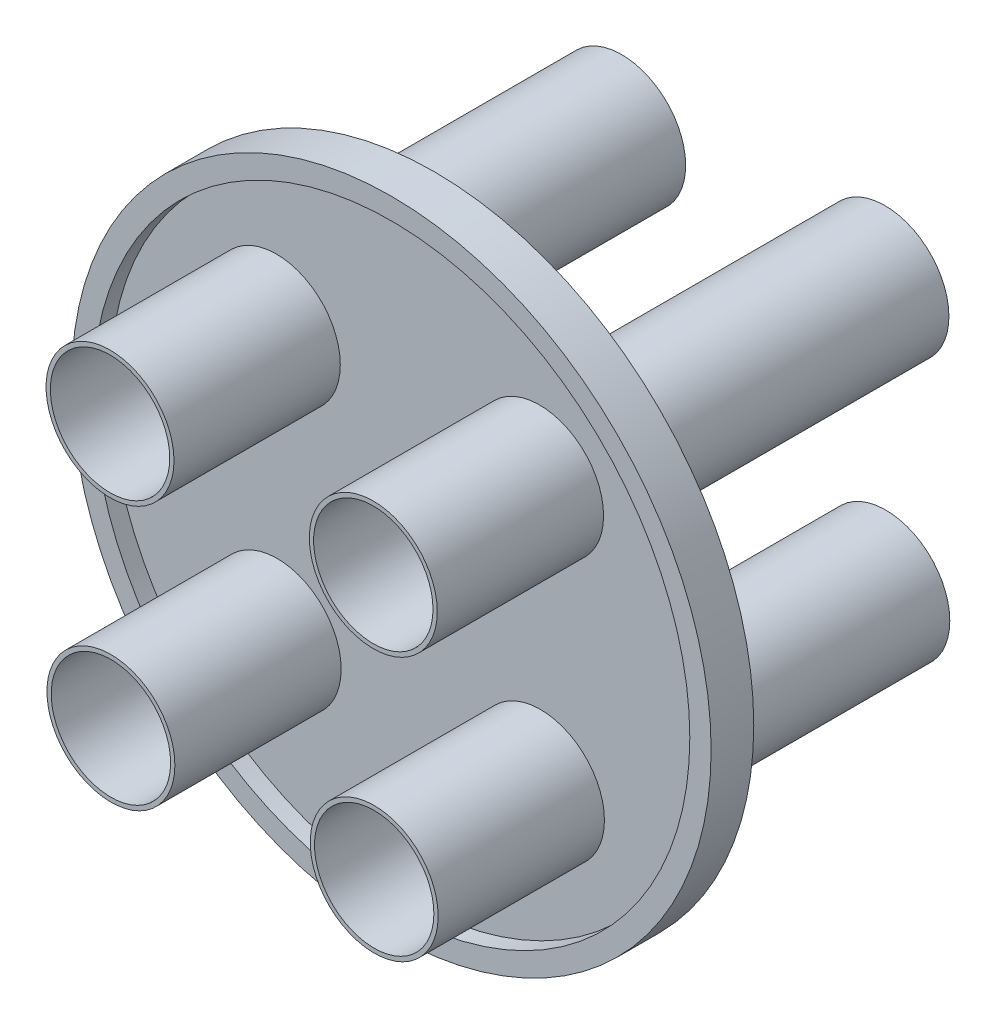
ISO-10303-21;
HEADER;
FILE_DESCRIPTION(('STEP AP214'),'2;1');
FILE_NAME('part.step','',(''),(''),'','','');
FILE_SCHEMA(('AUTOMOTIVE_DESIGN { 1 0 10303 214 1 1 1 1 }'));
ENDSEC;
DATA;
#1=APPLICATION_CONTEXT('core data for automotive mechanical design processes');
#2=APPLICATION_PROTOCOL_DEFINITION('international standard','automotive_design',2000,#1);
#3=PRODUCT_CONTEXT('',#1,'mechanical');
#4=PRODUCT('Part','Part','',(#3));
#5=PRODUCT_RELATED_PRODUCT_CATEGORY('part','',(#4));
#6=PRODUCT_DEFINITION_FORMATION('','',#4);
#7=PRODUCT_DEFINITION_CONTEXT('part definition',#1,'design');
#8=PRODUCT_DEFINITION('design','',#6,#7);
#9=PRODUCT_DEFINITION_SHAPE('','',#8);
#10=(LENGTH_UNIT() NAMED_UNIT(*) SI_UNIT(.MILLI.,.METRE.));
#11=(NAMED_UNIT(*) PLANE_ANGLE_UNIT() SI_UNIT($,.RADIAN.));
#12=(NAMED_UNIT(*) SI_UNIT($,.STERADIAN.) SOLID_ANGLE_UNIT());
#13=UNCERTAINTY_MEASURE_WITH_UNIT(LENGTH_MEASURE(1.E-05),#10,'distance_accuracy_value','');
#14=(GEOMETRIC_REPRESENTATION_CONTEXT(3) GLOBAL_UNCERTAINTY_ASSIGNED_CONTEXT((#13)) GLOBAL_UNIT_ASSIGNED_CONTEXT((#10,
#11,#12)) REPRESENTATION_CONTEXT('',''));
#15=CARTESIAN_POINT('',(0.,0.,0.));
#16=DIRECTION('',(0.,0.,1.));
#17=DIRECTION('',(1.,0.,0.));
#18=AXIS2_PLACEMENT_3D('',#15,#16,#17);
#19=CARTESIAN_POINT('',(0.,0.,-2.5));
#20=DIRECTION('',(0.,0.,1.));
#21=DIRECTION('',(1.,0.,0.));
#22=AXIS2_PLACEMENT_3D('',#19,#20,#21);
#23=CYLINDRICAL_SURFACE('',#22,35.);
#24=CARTESIAN_POINT('',(0.,0.,-2.5));
#25=DIRECTION('',(0.,0.,1.));
#26=DIRECTION('',(1.,0.,0.));
#27=AXIS2_PLACEMENT_3D('',#24,#25,#26);
#28=CIRCLE('',#27,35.);
#29=CARTESIAN_POINT('',(35.,0.,-2.5));
#30=VERTEX_POINT('',#29);
#31=EDGE_CURVE('E44',#30,#30,#28,.T.);
#32=ORIENTED_EDGE('',*,*,#31,.F.);
#33=EDGE_LOOP('',(#32));
#34=FACE_BOUND('',#33,.T.);
#35=CARTESIAN_POINT('',(0.,0.,-0.5));
#36=DIRECTION('',(0.,0.,1.));
#37=DIRECTION('',(1.,0.,0.));
#38=AXIS2_PLACEMENT_3D('',#35,#36,#37);
#39=CIRCLE('',#38,35.);
#40=CARTESIAN_POINT('',(35.,0.,-0.5));
#41=VERTEX_POINT('',#40);
#42=EDGE_CURVE('E10',#41,#41,#39,.F.);
#43=ORIENTED_EDGE('',*,*,#42,.F.);
#44=EDGE_LOOP('',(#43));
#45=FACE_BOUND('',#44,.T.);
#46=ADVANCED_FACE('F33',(#34,#45),#23,.F.);
#47=CARTESIAN_POINT('',(0.,0.,0.5));
#48=DIRECTION('',(0.,0.,1.));
#49=DIRECTION('',(1.,0.,0.));
#50=AXIS2_PLACEMENT_3D('',#47,#48,#49);
#51=CIRCLE('',#50,35.);
#52=CARTESIAN_POINT('',(35.,0.,0.5));
#53=VERTEX_POINT('',#52);
#54=EDGE_CURVE('E59',#53,#53,#51,.T.);
#55=ORIENTED_EDGE('',*,*,#54,.F.);
#56=EDGE_LOOP('',(#55));
#57=FACE_BOUND('',#56,.T.);
#58=CARTESIAN_POINT('',(0.,0.,2.5));
#59=DIRECTION('',(0.,0.,1.));
#60=DIRECTION('',(1.,0.,0.));
#61=AXIS2_PLACEMENT_3D('',#58,#59,#60);
#62=CIRCLE('',#61,35.);
#63=CARTESIAN_POINT('',(35.,0.,2.5));
#64=VERTEX_POINT('',#63);
#65=EDGE_CURVE('E53',#64,#64,#62,.T.);
#66=ORIENTED_EDGE('',*,*,#65,.T.);
#67=EDGE_LOOP('',(#66));
#68=FACE_BOUND('',#67,.T.);
#69=ADVANCED_FACE('F35',(#57,#68),#23,.F.);
#70=CARTESIAN_POINT('',(0.,0.,-2.5));
#71=DIRECTION('',(0.,0.,1.));
#72=DIRECTION('',(1.,0.,0.));
#73=AXIS2_PLACEMENT_3D('',#70,#71,#72);
#74=CYLINDRICAL_SURFACE('',#73,37.5);
#75=CARTESIAN_POINT('',(0.,0.,-2.5));
#76=DIRECTION('',(0.,0.,1.));
#77=DIRECTION('',(1.,0.,0.));
#78=AXIS2_PLACEMENT_3D('',#75,#76,#77);
#79=CIRCLE('',#78,37.5);
#80=CARTESIAN_POINT('',(37.5,0.,-2.5));
#81=VERTEX_POINT('',#80);
#82=EDGE_CURVE('E40',#81,#81,#79,.T.);
#83=ORIENTED_EDGE('',*,*,#82,.T.);
#84=EDGE_LOOP('',(#83));
#85=FACE_BOUND('',#84,.T.);
#86=CARTESIAN_POINT('',(0.,0.,2.5));
#87=DIRECTION('',(0.,0.,1.));
#88=DIRECTION('',(1.,0.,0.));
#89=AXIS2_PLACEMENT_3D('',#86,#87,#88);
#90=CIRCLE('',#89,37.5);
#91=CARTESIAN_POINT('',(37.5,0.,2.5));
#92=VERTEX_POINT('',#91);
#93=EDGE_CURVE('E48',#92,#92,#90,.T.);
#94=ORIENTED_EDGE('',*,*,#93,.F.);
#95=EDGE_LOOP('',(#94));
#96=FACE_BOUND('',#95,.T.);
#97=ADVANCED_FACE('F168',(#85,#96),#74,.T.);
#98=CARTESIAN_POINT('',(0.,0.,-2.5));
#99=DIRECTION('',(0.,0.,1.));
#100=DIRECTION('',(1.,0.,0.));
#101=AXIS2_PLACEMENT_3D('',#98,#99,#100);
#102=PLANE('',#101);
#103=ORIENTED_EDGE('',*,*,#31,.T.);
#104=EDGE_LOOP('',(#103));
#105=FACE_BOUND('',#104,.T.);
#106=ORIENTED_EDGE('',*,*,#82,.F.);
#107=EDGE_LOOP('',(#106));
#108=FACE_BOUND('',#107,.T.);
#109=ADVANCED_FACE('F173',(#105,#108),#102,.F.);
#110=CARTESIAN_POINT('',(0.,0.,2.5));
#111=DIRECTION('',(0.,0.,1.));
#112=DIRECTION('',(1.,0.,0.));
#113=AXIS2_PLACEMENT_3D('',#110,#111,#112);
#114=PLANE('',#113);
#115=ORIENTED_EDGE('',*,*,#65,.F.);
#116=EDGE_LOOP('',(#115));
#117=FACE_BOUND('',#116,.T.);
#118=ORIENTED_EDGE('',*,*,#93,.T.);
#119=EDGE_LOOP('',(#118));
#120=FACE_BOUND('',#119,.T.);
#121=ADVANCED_FACE('F176',(#117,#120),#114,.T.);
#122=CARTESIAN_POINT('',(0.,0.,-0.5));
#123=DIRECTION('',(0.,0.,1.));
#124=DIRECTION('',(1.,0.,0.));
#125=AXIS2_PLACEMENT_3D('',#122,#123,#124);
#126=CYLINDRICAL_SURFACE('',#125,2.5);
#127=CARTESIAN_POINT('',(0.,0.,-0.5));
#128=DIRECTION('',(0.,0.,1.));
#129=DIRECTION('',(1.,0.,0.));
#130=AXIS2_PLACEMENT_3D('',#127,#128,#129);
#131=CIRCLE('',#130,2.5);
#132=CARTESIAN_POINT('',(2.5,0.,-0.5));
#133=VERTEX_POINT('',#132);
#134=EDGE_CURVE('E56',#133,#133,#131,.T.);
#135=ORIENTED_EDGE('',*,*,#134,.F.);
#136=EDGE_LOOP('',(#135));
#137=FACE_BOUND('',#136,.T.);
#138=CARTESIAN_POINT('',(0.,0.,0.5));
#139=DIRECTION('',(0.,0.,1.));
#140=DIRECTION('',(1.,0.,0.));
#141=AXIS2_PLACEMENT_3D('',#138,#139,#140);
#142=CIRCLE('',#141,2.5);
#143=CARTESIAN_POINT('',(2.5,0.,0.5));
#144=VERTEX_POINT('',#143);
#145=EDGE_CURVE('E62',#144,#144,#142,.T.);
#146=ORIENTED_EDGE('',*,*,#145,.T.);
#147=EDGE_LOOP('',(#146));
#148=FACE_BOUND('',#147,.T.);
#149=ADVANCED_FACE('F182',(#137,#148),#126,.F.);
#150=CARTESIAN_POINT('',(0.,0.,-0.5));
#151=DIRECTION('',(0.,0.,1.));
#152=DIRECTION('',(1.,0.,0.));
#153=AXIS2_PLACEMENT_3D('',#150,#151,#152);
#154=PLANE('',#153);
#155=CARTESIAN_POINT('',(-15.3847489088156,-15.4871845046991,-0.5));
#156=DIRECTION('',(0.,0.,1.));
#157=DIRECTION('',(1.,0.,0.));
#158=AXIS2_PLACEMENT_3D('',#155,#156,#157);
#159=CIRCLE('',#158,7.5);
#160=CARTESIAN_POINT('',(-7.88474890881562,-15.4871845046991,-0.5));
#161=VERTEX_POINT('',#160);
#162=EDGE_CURVE('E107',#161,#161,#159,.T.);
#163=ORIENTED_EDGE('',*,*,#162,.T.);
#164=EDGE_LOOP('',(#163));
#165=FACE_BOUND('',#164,.T.);
#166=CARTESIAN_POINT('',(15.4871845047001,-15.3847489088146,-0.5));
#167=DIRECTION('',(0.,0.,1.));
#168=DIRECTION('',(1.,0.,0.));
#169=AXIS2_PLACEMENT_3D('',#166,#167,#168);
#170=CIRCLE('',#169,7.50000000000122);
#171=CARTESIAN_POINT('',(22.9871845047013,-15.3847489088146,-0.5));
#172=VERTEX_POINT('',#171);
#173=EDGE_CURVE('E122',#172,#172,#170,.T.);
#174=ORIENTED_EDGE('',*,*,#173,.T.);
#175=EDGE_LOOP('',(#174));
#176=FACE_BOUND('',#175,.T.);
#177=CARTESIAN_POINT('',(15.3847489088155,15.4871845046992,-0.5));
#178=DIRECTION('',(0.,0.,1.));
#179=DIRECTION('',(1.,0.,0.));
#180=AXIS2_PLACEMENT_3D('',#177,#178,#179);
#181=CIRCLE('',#180,7.5);
#182=CARTESIAN_POINT('',(22.8847489088155,15.4871845046992,-0.5));
#183=VERTEX_POINT('',#182);
#184=EDGE_CURVE('E77',#183,#183,#181,.T.);
#185=ORIENTED_EDGE('',*,*,#184,.T.);
#186=EDGE_LOOP('',(#185));
#187=FACE_BOUND('',#186,.T.);
#188=CARTESIAN_POINT('',(-15.4871845046992,15.3847489088155,-0.5));
#189=DIRECTION('',(0.,0.,1.));
#190=DIRECTION('',(1.,0.,0.));
#191=AXIS2_PLACEMENT_3D('',#188,#189,#190);
#192=CIRCLE('',#191,7.5);
#193=CARTESIAN_POINT('',(-7.98718450469923,15.3847489088155,-0.5));
#194=VERTEX_POINT('',#193);
#195=EDGE_CURVE('E92',#194,#194,#192,.T.);
#196=ORIENTED_EDGE('',*,*,#195,.T.);
#197=EDGE_LOOP('',(#196));
#198=FACE_BOUND('',#197,.T.);
#199=ORIENTED_EDGE('',*,*,#134,.T.);
#200=EDGE_LOOP('',(#199));
#201=FACE_BOUND('',#200,.T.);
#202=ORIENTED_EDGE('',*,*,#42,.T.);
#203=EDGE_LOOP('',(#202));
#204=FACE_BOUND('',#203,.T.);
#205=ADVANCED_FACE('F188',(#165,#176,#187,#198,#201,#204),#154,.F.);
#206=CARTESIAN_POINT('',(0.,0.,0.5));
#207=DIRECTION('',(0.,0.,1.));
#208=DIRECTION('',(1.,0.,0.));
#209=AXIS2_PLACEMENT_3D('',#206,#207,#208);
#210=PLANE('',#209);
#211=CARTESIAN_POINT('',(-15.3847489088156,-15.4871845046991,0.5));
#212=DIRECTION('',(0.,0.,1.));
#213=DIRECTION('',(1.,0.,0.));
#214=AXIS2_PLACEMENT_3D('',#211,#212,#213);
#215=CIRCLE('',#214,7.5);
#216=CARTESIAN_POINT('',(-7.88474890881562,-15.4871845046991,0.5));
#217=VERTEX_POINT('',#216);
#218=EDGE_CURVE('E74',#217,#217,#215,.T.);
#219=ORIENTED_EDGE('',*,*,#218,.F.);
#220=EDGE_LOOP('',(#219));
#221=FACE_BOUND('',#220,.T.);
#222=CARTESIAN_POINT('',(15.4871845047001,-15.3847489088146,0.5));
#223=DIRECTION('',(0.,0.,1.));
#224=DIRECTION('',(1.,0.,0.));
#225=AXIS2_PLACEMENT_3D('',#222,#223,#224);
#226=CIRCLE('',#225,7.50000000000122);
#227=CARTESIAN_POINT('',(22.9871845047013,-15.3847489088146,0.5));
#228=VERTEX_POINT('',#227);
#229=EDGE_CURVE('E71',#228,#228,#226,.T.);
#230=ORIENTED_EDGE('',*,*,#229,.F.);
#231=EDGE_LOOP('',(#230));
#232=FACE_BOUND('',#231,.T.);
#233=CARTESIAN_POINT('',(15.3847489088155,15.4871845046992,0.5));
#234=DIRECTION('',(0.,0.,1.));
#235=DIRECTION('',(1.,0.,0.));
#236=AXIS2_PLACEMENT_3D('',#233,#234,#235);
#237=CIRCLE('',#236,7.5);
#238=CARTESIAN_POINT('',(22.8847489088155,15.4871845046992,0.5));
#239=VERTEX_POINT('',#238);
#240=EDGE_CURVE('E68',#239,#239,#237,.T.);
#241=ORIENTED_EDGE('',*,*,#240,.F.);
#242=EDGE_LOOP('',(#241));
#243=FACE_BOUND('',#242,.T.);
#244=CARTESIAN_POINT('',(-15.4871845046992,15.3847489088155,0.5));
#245=DIRECTION('',(0.,0.,1.));
#246=DIRECTION('',(1.,0.,0.));
#247=AXIS2_PLACEMENT_3D('',#244,#245,#246);
#248=CIRCLE('',#247,7.5);
#249=CARTESIAN_POINT('',(-7.98718450469923,15.3847489088155,0.5));
#250=VERTEX_POINT('',#249);
#251=EDGE_CURVE('E65',#250,#250,#248,.T.);
#252=ORIENTED_EDGE('',*,*,#251,.F.);
#253=EDGE_LOOP('',(#252));
#254=FACE_BOUND('',#253,.T.);
#255=ORIENTED_EDGE('',*,*,#145,.F.);
#256=EDGE_LOOP('',(#255));
#257=FACE_BOUND('',#256,.T.);
#258=ORIENTED_EDGE('',*,*,#54,.T.);
#259=EDGE_LOOP('',(#258));
#260=FACE_BOUND('',#259,.T.);
#261=ADVANCED_FACE('F192',(#221,#232,#243,#254,#257,#260),#210,.T.);
#262=CARTESIAN_POINT('',(15.3847489088155,15.4871845046992,-40.));
#263=DIRECTION('',(0.,0.,1.));
#264=DIRECTION('',(1.,0.,0.));
#265=AXIS2_PLACEMENT_3D('',#262,#263,#264);
#266=CYLINDRICAL_SURFACE('',#265,7.5);
#267=CARTESIAN_POINT('',(15.3847489088155,15.4871845046992,-40.));
#268=DIRECTION('',(0.,0.,1.));
#269=DIRECTION('',(1.,0.,0.));
#270=AXIS2_PLACEMENT_3D('',#267,#268,#269);
#271=CIRCLE('',#270,7.5);
#272=CARTESIAN_POINT('',(22.8847489088155,15.4871845046992,-40.));
#273=VERTEX_POINT('',#272);
#274=EDGE_CURVE('E80',#273,#273,#271,.T.);
#275=ORIENTED_EDGE('',*,*,#274,.T.);
#276=EDGE_LOOP('',(#275));
#277=FACE_BOUND('',#276,.T.);
#278=ORIENTED_EDGE('',*,*,#184,.F.);
#279=EDGE_LOOP('',(#278));
#280=FACE_BOUND('',#279,.T.);
#281=ADVANCED_FACE('F196',(#277,#280),#266,.T.);
#282=CARTESIAN_POINT('',(15.3847489088155,15.4871845046992,-40.));
#283=DIRECTION('',(0.,0.,1.));
#284=DIRECTION('',(1.,0.,0.));
#285=AXIS2_PLACEMENT_3D('',#282,#283,#284);
#286=CYLINDRICAL_SURFACE('',#285,7.);
#287=CARTESIAN_POINT('',(15.3847489088155,15.4871845046992,-40.));
#288=DIRECTION('',(0.,0.,1.));
#289=DIRECTION('',(1.,0.,0.));
#290=AXIS2_PLACEMENT_3D('',#287,#288,#289);
#291=CIRCLE('',#290,7.);
#292=CARTESIAN_POINT('',(22.3847489088155,15.4871845046992,-40.));
#293=VERTEX_POINT('',#292);
#294=EDGE_CURVE('E83',#293,#293,#291,.T.);
#295=ORIENTED_EDGE('',*,*,#294,.F.);
#296=EDGE_LOOP('',(#295));
#297=FACE_BOUND('',#296,.T.);
#298=CARTESIAN_POINT('',(15.3847489088155,15.4871845046992,20.));
#299=DIRECTION('',(0.,0.,1.));
#300=DIRECTION('',(1.,0.,0.));
#301=AXIS2_PLACEMENT_3D('',#298,#299,#300);
#302=CIRCLE('',#301,7.);
#303=CARTESIAN_POINT('',(22.3847489088155,15.4871845046992,20.));
#304=VERTEX_POINT('',#303);
#305=EDGE_CURVE('E89',#304,#304,#302,.T.);
#306=ORIENTED_EDGE('',*,*,#305,.T.);
#307=EDGE_LOOP('',(#306));
#308=FACE_BOUND('',#307,.T.);
#309=ADVANCED_FACE('F198',(#297,#308),#286,.F.);
#310=ORIENTED_EDGE('',*,*,#240,.T.);
#311=EDGE_LOOP('',(#310));
#312=FACE_BOUND('',#311,.T.);
#313=CARTESIAN_POINT('',(15.3847489088155,15.4871845046992,20.));
#314=DIRECTION('',(0.,0.,1.));
#315=DIRECTION('',(1.,0.,0.));
#316=AXIS2_PLACEMENT_3D('',#313,#314,#315);
#317=CIRCLE('',#316,7.5);
#318=CARTESIAN_POINT('',(22.8847489088155,15.4871845046992,20.));
#319=VERTEX_POINT('',#318);
#320=EDGE_CURVE('E86',#319,#319,#317,.T.);
#321=ORIENTED_EDGE('',*,*,#320,.F.);
#322=EDGE_LOOP('',(#321));
#323=FACE_BOUND('',#322,.T.);
#324=ADVANCED_FACE('F201',(#312,#323),#266,.T.);
#325=CARTESIAN_POINT('',(0.,0.,-40.));
#326=DIRECTION('',(0.,0.,1.));
#327=DIRECTION('',(1.,0.,0.));
#328=AXIS2_PLACEMENT_3D('',#325,#326,#327);
#329=PLANE('',#328);
#330=ORIENTED_EDGE('',*,*,#294,.T.);
#331=EDGE_LOOP('',(#330));
#332=FACE_BOUND('',#331,.T.);
#333=ORIENTED_EDGE('',*,*,#274,.F.);
#334=EDGE_LOOP('',(#333));
#335=FACE_BOUND('',#334,.T.);
#336=ADVANCED_FACE('F205',(#332,#335),#329,.F.);
#337=CARTESIAN_POINT('',(0.,0.,20.));
#338=DIRECTION('',(0.,0.,1.));
#339=DIRECTION('',(1.,0.,0.));
#340=AXIS2_PLACEMENT_3D('',#337,#338,#339);
#341=PLANE('',#340);
#342=ORIENTED_EDGE('',*,*,#305,.F.);
#343=EDGE_LOOP('',(#342));
#344=FACE_BOUND('',#343,.T.);
#345=ORIENTED_EDGE('',*,*,#320,.T.);
#346=EDGE_LOOP('',(#345));
#347=FACE_BOUND('',#346,.T.);
#348=ADVANCED_FACE('F209',(#344,#347),#341,.T.);
#349=CARTESIAN_POINT('',(-15.4871845046992,15.3847489088155,-40.));
#350=DIRECTION('',(0.,0.,1.));
#351=DIRECTION('',(1.,0.,0.));
#352=AXIS2_PLACEMENT_3D('',#349,#350,#351);
#353=CYLINDRICAL_SURFACE('',#352,7.5);
#354=CARTESIAN_POINT('',(-15.4871845046992,15.3847489088155,-40.));
#355=DIRECTION('',(0.,0.,1.));
#356=DIRECTION('',(1.,0.,0.));
#357=AXIS2_PLACEMENT_3D('',#354,#355,#356);
#358=CIRCLE('',#357,7.5);
#359=CARTESIAN_POINT('',(-7.98718450469923,15.3847489088155,-40.));
#360=VERTEX_POINT('',#359);
#361=EDGE_CURVE('E95',#360,#360,#358,.T.);
#362=ORIENTED_EDGE('',*,*,#361,.T.);
#363=EDGE_LOOP('',(#362));
#364=FACE_BOUND('',#363,.T.);
#365=ORIENTED_EDGE('',*,*,#195,.F.);
#366=EDGE_LOOP('',(#365));
#367=FACE_BOUND('',#366,.T.);
#368=ADVANCED_FACE('F213',(#364,#367),#353,.T.);
#369=CARTESIAN_POINT('',(-15.4871845046992,15.3847489088155,-40.));
#370=DIRECTION('',(0.,0.,1.));
#371=DIRECTION('',(1.,0.,0.));
#372=AXIS2_PLACEMENT_3D('',#369,#370,#371);
#373=CYLINDRICAL_SURFACE('',#372,7.);
#374=CARTESIAN_POINT('',(-15.4871845046992,15.3847489088155,-40.));
#375=DIRECTION('',(0.,0.,1.));
#376=DIRECTION('',(1.,0.,0.));
#377=AXIS2_PLACEMENT_3D('',#374,#375,#376);
#378=CIRCLE('',#377,7.);
#379=CARTESIAN_POINT('',(-8.48718450469923,15.3847489088155,-40.));
#380=VERTEX_POINT('',#379);
#381=EDGE_CURVE('E98',#380,#380,#378,.T.);
#382=ORIENTED_EDGE('',*,*,#381,.F.);
#383=EDGE_LOOP('',(#382));
#384=FACE_BOUND('',#383,.T.);
#385=CARTESIAN_POINT('',(-15.4871845046992,15.3847489088155,20.));
#386=DIRECTION('',(0.,0.,1.));
#387=DIRECTION('',(1.,0.,0.));
#388=AXIS2_PLACEMENT_3D('',#385,#386,#387);
#389=CIRCLE('',#388,7.);
#390=CARTESIAN_POINT('',(-8.48718450469923,15.3847489088155,20.));
#391=VERTEX_POINT('',#390);
#392=EDGE_CURVE('E104',#391,#391,#389,.T.);
#393=ORIENTED_EDGE('',*,*,#392,.T.);
#394=EDGE_LOOP('',(#393));
#395=FACE_BOUND('',#394,.T.);
#396=ADVANCED_FACE('F215',(#384,#395),#373,.F.);
#397=ORIENTED_EDGE('',*,*,#251,.T.);
#398=EDGE_LOOP('',(#397));
#399=FACE_BOUND('',#398,.T.);
#400=CARTESIAN_POINT('',(-15.4871845046992,15.3847489088155,20.));
#401=DIRECTION('',(0.,0.,1.));
#402=DIRECTION('',(1.,0.,0.));
#403=AXIS2_PLACEMENT_3D('',#400,#401,#402);
#404=CIRCLE('',#403,7.5);
#405=CARTESIAN_POINT('',(-7.98718450469923,15.3847489088155,20.));
#406=VERTEX_POINT('',#405);
#407=EDGE_CURVE('E101',#406,#406,#404,.T.);
#408=ORIENTED_EDGE('',*,*,#407,.F.);
#409=EDGE_LOOP('',(#408));
#410=FACE_BOUND('',#409,.T.);
#411=ADVANCED_FACE('F218',(#399,#410),#353,.T.);
#412=CARTESIAN_POINT('',(0.,0.,-40.));
#413=DIRECTION('',(0.,0.,1.));
#414=DIRECTION('',(1.,0.,0.));
#415=AXIS2_PLACEMENT_3D('',#412,#413,#414);
#416=PLANE('',#415);
#417=ORIENTED_EDGE('',*,*,#381,.T.);
#418=EDGE_LOOP('',(#417));
#419=FACE_BOUND('',#418,.T.);
#420=ORIENTED_EDGE('',*,*,#361,.F.);
#421=EDGE_LOOP('',(#420));
#422=FACE_BOUND('',#421,.T.);
#423=ADVANCED_FACE('F222',(#419,#422),#416,.F.);
#424=CARTESIAN_POINT('',(0.,0.,20.));
#425=DIRECTION('',(0.,0.,1.));
#426=DIRECTION('',(1.,0.,0.));
#427=AXIS2_PLACEMENT_3D('',#424,#425,#426);
#428=PLANE('',#427);
#429=ORIENTED_EDGE('',*,*,#392,.F.);
#430=EDGE_LOOP('',(#429));
#431=FACE_BOUND('',#430,.T.);
#432=ORIENTED_EDGE('',*,*,#407,.T.);
#433=EDGE_LOOP('',(#432));
#434=FACE_BOUND('',#433,.T.);
#435=ADVANCED_FACE('F226',(#431,#434),#428,.T.);
#436=CARTESIAN_POINT('',(-15.3847489088156,-15.4871845046991,-40.));
#437=DIRECTION('',(0.,0.,1.));
#438=DIRECTION('',(1.,0.,0.));
#439=AXIS2_PLACEMENT_3D('',#436,#437,#438);
#440=CYLINDRICAL_SURFACE('',#439,7.5);
#441=CARTESIAN_POINT('',(-15.3847489088156,-15.4871845046991,-40.));
#442=DIRECTION('',(0.,0.,1.));
#443=DIRECTION('',(1.,0.,0.));
#444=AXIS2_PLACEMENT_3D('',#441,#442,#443);
#445=CIRCLE('',#444,7.5);
#446=CARTESIAN_POINT('',(-7.88474890881562,-15.4871845046991,-40.));
#447=VERTEX_POINT('',#446);
#448=EDGE_CURVE('E110',#447,#447,#445,.T.);
#449=ORIENTED_EDGE('',*,*,#448,.T.);
#450=EDGE_LOOP('',(#449));
#451=FACE_BOUND('',#450,.T.);
#452=ORIENTED_EDGE('',*,*,#162,.F.);
#453=EDGE_LOOP('',(#452));
#454=FACE_BOUND('',#453,.T.);
#455=ADVANCED_FACE('F230',(#451,#454),#440,.T.);
#456=CARTESIAN_POINT('',(-15.3847489088156,-15.4871845046991,-40.));
#457=DIRECTION('',(0.,0.,1.));
#458=DIRECTION('',(1.,0.,0.));
#459=AXIS2_PLACEMENT_3D('',#456,#457,#458);
#460=CYLINDRICAL_SURFACE('',#459,7.);
#461=CARTESIAN_POINT('',(-15.3847489088156,-15.4871845046991,-40.));
#462=DIRECTION('',(0.,0.,1.));
#463=DIRECTION('',(1.,0.,0.));
#464=AXIS2_PLACEMENT_3D('',#461,#462,#463);
#465=CIRCLE('',#464,7.);
#466=CARTESIAN_POINT('',(-8.38474890881562,-15.4871845046991,-40.));
#467=VERTEX_POINT('',#466);
#468=EDGE_CURVE('E113',#467,#467,#465,.T.);
#469=ORIENTED_EDGE('',*,*,#468,.F.);
#470=EDGE_LOOP('',(#469));
#471=FACE_BOUND('',#470,.T.);
#472=CARTESIAN_POINT('',(-15.3847489088156,-15.4871845046991,20.));
#473=DIRECTION('',(0.,0.,1.));
#474=DIRECTION('',(1.,0.,0.));
#475=AXIS2_PLACEMENT_3D('',#472,#473,#474);
#476=CIRCLE('',#475,7.);
#477=CARTESIAN_POINT('',(-8.38474890881562,-15.4871845046991,20.));
#478=VERTEX_POINT('',#477);
#479=EDGE_CURVE('E119',#478,#478,#476,.T.);
#480=ORIENTED_EDGE('',*,*,#479,.T.);
#481=EDGE_LOOP('',(#480));
#482=FACE_BOUND('',#481,.T.);
#483=ADVANCED_FACE('F232',(#471,#482),#460,.F.);
#484=ORIENTED_EDGE('',*,*,#218,.T.);
#485=EDGE_LOOP('',(#484));
#486=FACE_BOUND('',#485,.T.);
#487=CARTESIAN_POINT('',(-15.3847489088156,-15.4871845046991,20.));
#488=DIRECTION('',(0.,0.,1.));
#489=DIRECTION('',(1.,0.,0.));
#490=AXIS2_PLACEMENT_3D('',#487,#488,#489);
#491=CIRCLE('',#490,7.5);
#492=CARTESIAN_POINT('',(-7.88474890881562,-15.4871845046991,20.));
#493=VERTEX_POINT('',#492);
#494=EDGE_CURVE('E116',#493,#493,#491,.T.);
#495=ORIENTED_EDGE('',*,*,#494,.F.);
#496=EDGE_LOOP('',(#495));
#497=FACE_BOUND('',#496,.T.);
#498=ADVANCED_FACE('F235',(#486,#497),#440,.T.);
#499=CARTESIAN_POINT('',(0.,0.,-40.));
#500=DIRECTION('',(0.,0.,1.));
#501=DIRECTION('',(1.,0.,0.));
#502=AXIS2_PLACEMENT_3D('',#499,#500,#501);
#503=PLANE('',#502);
#504=ORIENTED_EDGE('',*,*,#468,.T.);
#505=EDGE_LOOP('',(#504));
#506=FACE_BOUND('',#505,.T.);
#507=ORIENTED_EDGE('',*,*,#448,.F.);
#508=EDGE_LOOP('',(#507));
#509=FACE_BOUND('',#508,.T.);
#510=ADVANCED_FACE('F239',(#506,#509),#503,.F.);
#511=CARTESIAN_POINT('',(0.,0.,20.));
#512=DIRECTION('',(0.,0.,1.));
#513=DIRECTION('',(1.,0.,0.));
#514=AXIS2_PLACEMENT_3D('',#511,#512,#513);
#515=PLANE('',#514);
#516=ORIENTED_EDGE('',*,*,#479,.F.);
#517=EDGE_LOOP('',(#516));
#518=FACE_BOUND('',#517,.T.);
#519=ORIENTED_EDGE('',*,*,#494,.T.);
#520=EDGE_LOOP('',(#519));
#521=FACE_BOUND('',#520,.T.);
#522=ADVANCED_FACE('F161',(#518,#521),#515,.T.);
#523=CARTESIAN_POINT('',(15.4871845047001,-15.3847489088146,-40.));
#524=DIRECTION('',(0.,0.,1.));
#525=DIRECTION('',(1.,0.,0.));
#526=AXIS2_PLACEMENT_3D('',#523,#524,#525);
#527=CYLINDRICAL_SURFACE('',#526,7.50000000000122);
#528=CARTESIAN_POINT('',(15.4871845047001,-15.3847489088146,-40.));
#529=DIRECTION('',(0.,0.,1.));
#530=DIRECTION('',(1.,0.,0.));
#531=AXIS2_PLACEMENT_3D('',#528,#529,#530);
#532=CIRCLE('',#531,7.50000000000122);
#533=CARTESIAN_POINT('',(22.9871845047013,-15.3847489088146,-40.));
#534=VERTEX_POINT('',#533);
#535=EDGE_CURVE('E125',#534,#534,#532,.T.);
#536=ORIENTED_EDGE('',*,*,#535,.T.);
#537=EDGE_LOOP('',(#536));
#538=FACE_BOUND('',#537,.T.);
#539=ORIENTED_EDGE('',*,*,#173,.F.);
#540=EDGE_LOOP('',(#539));
#541=FACE_BOUND('',#540,.T.);
#542=ADVANCED_FACE('F151',(#538,#541),#527,.T.);
#543=CARTESIAN_POINT('',(15.4871845047001,-15.3847489088146,-40.));
#544=DIRECTION('',(0.,0.,1.));
#545=DIRECTION('',(1.,0.,0.));
#546=AXIS2_PLACEMENT_3D('',#543,#544,#545);
#547=CYLINDRICAL_SURFACE('',#546,7.00000000000122);
#548=CARTESIAN_POINT('',(15.4871845047001,-15.3847489088146,-40.));
#549=DIRECTION('',(0.,0.,1.));
#550=DIRECTION('',(1.,0.,0.));
#551=AXIS2_PLACEMENT_3D('',#548,#549,#550);
#552=CIRCLE('',#551,7.00000000000122);
#553=CARTESIAN_POINT('',(22.4871845047013,-15.3847489088146,-40.));
#554=VERTEX_POINT('',#553);
#555=EDGE_CURVE('E128',#554,#554,#552,.T.);
#556=ORIENTED_EDGE('',*,*,#555,.F.);
#557=EDGE_LOOP('',(#556));
#558=FACE_BOUND('',#557,.T.);
#559=CARTESIAN_POINT('',(15.4871845047001,-15.3847489088146,20.));
#560=DIRECTION('',(0.,0.,1.));
#561=DIRECTION('',(1.,0.,0.));
#562=AXIS2_PLACEMENT_3D('',#559,#560,#561);
#563=CIRCLE('',#562,7.00000000000122);
#564=CARTESIAN_POINT('',(22.4871845047013,-15.3847489088146,20.));
#565=VERTEX_POINT('',#564);
#566=EDGE_CURVE('E134',#565,#565,#563,.T.);
#567=ORIENTED_EDGE('',*,*,#566,.T.);
#568=EDGE_LOOP('',(#567));
#569=FACE_BOUND('',#568,.T.);
#570=ADVANCED_FACE('F138',(#558,#569),#547,.F.);
#571=ORIENTED_EDGE('',*,*,#229,.T.);
#572=EDGE_LOOP('',(#571));
#573=FACE_BOUND('',#572,.T.);
#574=CARTESIAN_POINT('',(15.4871845047001,-15.3847489088146,20.));
#575=DIRECTION('',(0.,0.,1.));
#576=DIRECTION('',(1.,0.,0.));
#577=AXIS2_PLACEMENT_3D('',#574,#575,#576);
#578=CIRCLE('',#577,7.50000000000122);
#579=CARTESIAN_POINT('',(22.9871845047013,-15.3847489088146,20.));
#580=VERTEX_POINT('',#579);
#581=EDGE_CURVE('E131',#580,#580,#578,.T.);
#582=ORIENTED_EDGE('',*,*,#581,.F.);
#583=EDGE_LOOP('',(#582));
#584=FACE_BOUND('',#583,.T.);
#585=ADVANCED_FACE('F147',(#573,#584),#527,.T.);
#586=CARTESIAN_POINT('',(0.,0.,-40.));
#587=DIRECTION('',(0.,0.,1.));
#588=DIRECTION('',(1.,0.,0.));
#589=AXIS2_PLACEMENT_3D('',#586,#587,#588);
#590=PLANE('',#589);
#591=ORIENTED_EDGE('',*,*,#555,.T.);
#592=EDGE_LOOP('',(#591));
#593=FACE_BOUND('',#592,.T.);
#594=ORIENTED_EDGE('',*,*,#535,.F.);
#595=EDGE_LOOP('',(#594));
#596=FACE_BOUND('',#595,.T.);
#597=ADVANCED_FACE('F143',(#593,#596),#590,.F.);
#598=CARTESIAN_POINT('',(0.,0.,20.));
#599=DIRECTION('',(0.,0.,1.));
#600=DIRECTION('',(1.,0.,0.));
#601=AXIS2_PLACEMENT_3D('',#598,#599,#600);
#602=PLANE('',#601);
#603=ORIENTED_EDGE('',*,*,#566,.F.);
#604=EDGE_LOOP('',(#603));
#605=FACE_BOUND('',#604,.T.);
#606=ORIENTED_EDGE('',*,*,#581,.T.);
#607=EDGE_LOOP('',(#606));
#608=FACE_BOUND('',#607,.T.);
#609=ADVANCED_FACE('F140',(#605,#608),#602,.T.);
#610=CLOSED_SHELL('',(#46,#69,#97,#109,#121,#149,#205,#261,#281,#309,#324,#336,#348,#368,#396,
#411,#423,#435,#455,#483,#498,#510,#522,#542,#570,#585,#597,#609));
#611=MANIFOLD_SOLID_BREP('B2',#610);
#612=ADVANCED_BREP_SHAPE_REPRESENTATION('',(#18,#611),#14);
#613=SHAPE_DEFINITION_REPRESENTATION(#9,#612);
ENDSEC;
END-ISO-10303-21;
